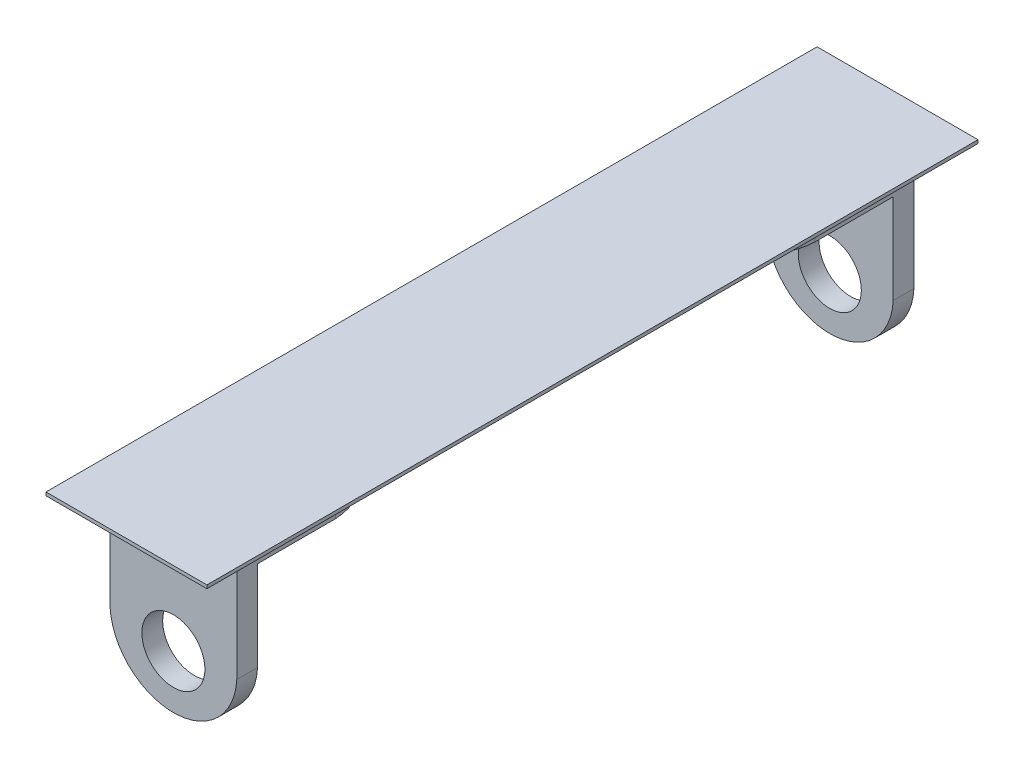
ISO-10303-21;
HEADER;
FILE_DESCRIPTION(('STEP AP214'),'2;1');
FILE_NAME('part.step','',(''),(''),'','','');
FILE_SCHEMA(('AUTOMOTIVE_DESIGN { 1 0 10303 214 1 1 1 1 }'));
ENDSEC;
DATA;
#1=APPLICATION_CONTEXT('core data for automotive mechanical design processes');
#2=APPLICATION_PROTOCOL_DEFINITION('international standard','automotive_design',2000,#1);
#3=PRODUCT_CONTEXT('',#1,'mechanical');
#4=PRODUCT('Part','Part','',(#3));
#5=PRODUCT_RELATED_PRODUCT_CATEGORY('part','',(#4));
#6=PRODUCT_DEFINITION_FORMATION('','',#4);
#7=PRODUCT_DEFINITION_CONTEXT('part definition',#1,'design');
#8=PRODUCT_DEFINITION('design','',#6,#7);
#9=PRODUCT_DEFINITION_SHAPE('','',#8);
#10=(LENGTH_UNIT() NAMED_UNIT(*) SI_UNIT(.MILLI.,.METRE.));
#11=(NAMED_UNIT(*) PLANE_ANGLE_UNIT() SI_UNIT($,.RADIAN.));
#12=(NAMED_UNIT(*) SI_UNIT($,.STERADIAN.) SOLID_ANGLE_UNIT());
#13=UNCERTAINTY_MEASURE_WITH_UNIT(LENGTH_MEASURE(1.E-05),#10,'distance_accuracy_value','');
#14=(GEOMETRIC_REPRESENTATION_CONTEXT(3) GLOBAL_UNCERTAINTY_ASSIGNED_CONTEXT((#13)) GLOBAL_UNIT_ASSIGNED_CONTEXT((#10,
#11,#12)) REPRESENTATION_CONTEXT('',''));
#15=CARTESIAN_POINT('',(0.,0.,0.));
#16=DIRECTION('',(0.,0.,1.));
#17=DIRECTION('',(1.,0.,0.));
#18=AXIS2_PLACEMENT_3D('',#15,#16,#17);
#19=CARTESIAN_POINT('',(0.,1.37217727272736,9.19479999999988));
#20=DIRECTION('',(0.,-1.,0.));
#21=DIRECTION('',(0.,0.,1.));
#22=AXIS2_PLACEMENT_3D('',#19,#20,#21);
#23=SPHERICAL_SURFACE('',#22,2.71837727272727);
#24=CARTESIAN_POINT('',(0.,-0.7874,9.19479999999988));
#25=DIRECTION('',(0.,-1.,0.));
#26=DIRECTION('',(0.,0.,-1.));
#27=AXIS2_PLACEMENT_3D('',#24,#25,#26);
#28=CIRCLE('',#27,1.65099999999988);
#29=CARTESIAN_POINT('',(0.,-0.7874,7.5438));
#30=VERTEX_POINT('',#29);
#31=EDGE_CURVE('E542',#30,#30,#28,.F.);
#32=ORIENTED_EDGE('',*,*,#31,.F.);
#33=EDGE_LOOP('',(#32));
#34=FACE_BOUND('',#33,.T.);
#35=CARTESIAN_POINT('',(0.,-1.34619999999991,9.19479999999988));
#36=VERTEX_POINT('',#35);
#37=VERTEX_LOOP('',#36);
#38=FACE_BOUND('',#37,.T.);
#39=ADVANCED_FACE('F17',(#34,#38),#23,.T.);
#40=CARTESIAN_POINT('',(-3.048,0.127,-14.605));
#41=DIRECTION('',(0.,1.,0.));
#42=DIRECTION('',(0.,0.,1.));
#43=AXIS2_PLACEMENT_3D('',#40,#41,#42);
#44=PLANE('',#43);
#45=DIRECTION('',(-1.,0.,0.));
#46=VECTOR('',#45,1.);
#47=CARTESIAN_POINT('',(0.,0.127,14.605));
#48=LINE('',#47,#46);
#49=CARTESIAN_POINT('',(3.048,0.127,14.605));
#50=VERTEX_POINT('',#49);
#51=CARTESIAN_POINT('',(-3.048,0.127,14.605));
#52=VERTEX_POINT('',#51);
#53=EDGE_CURVE('E150',#50,#52,#48,.T.);
#54=ORIENTED_EDGE('',*,*,#53,.F.);
#55=DIRECTION('',(0.,0.,1.));
#56=VECTOR('',#55,1.);
#57=CARTESIAN_POINT('',(3.048,0.127,0.));
#58=LINE('',#57,#56);
#59=CARTESIAN_POINT('',(3.048,0.127,-14.605));
#60=VERTEX_POINT('',#59);
#61=EDGE_CURVE('E256',#60,#50,#58,.T.);
#62=ORIENTED_EDGE('',*,*,#61,.F.);
#63=DIRECTION('',(1.,0.,0.));
#64=VECTOR('',#63,1.);
#65=CARTESIAN_POINT('',(0.,0.127,-14.605));
#66=LINE('',#65,#64);
#67=CARTESIAN_POINT('',(-3.048,0.127,-14.605));
#68=VERTEX_POINT('',#67);
#69=EDGE_CURVE('E261',#68,#60,#66,.T.);
#70=ORIENTED_EDGE('',*,*,#69,.F.);
#71=DIRECTION('',(0.,0.,-1.));
#72=VECTOR('',#71,1.);
#73=CARTESIAN_POINT('',(-3.048,0.127,0.));
#74=LINE('',#73,#72);
#75=EDGE_CURVE('E154',#52,#68,#74,.T.);
#76=ORIENTED_EDGE('',*,*,#75,.F.);
#77=EDGE_LOOP('',(#54,#62,#70,#76));
#78=FACE_BOUND('',#77,.T.);
#79=ADVANCED_FACE('F302',(#78),#44,.T.);
#80=CARTESIAN_POINT('',(0.,-4.0738425,12.827));
#81=DIRECTION('',(0.,0.,1.));
#82=DIRECTION('',(0.,-1.,0.));
#83=AXIS2_PLACEMENT_3D('',#80,#81,#82);
#84=CYLINDRICAL_SURFACE('',#83,2.4031575);
#85=CARTESIAN_POINT('',(0.,-4.0738425,12.0396));
#86=DIRECTION('',(0.,0.,1.));
#87=DIRECTION('',(0.,-1.,0.));
#88=AXIS2_PLACEMENT_3D('',#85,#86,#87);
#89=CIRCLE('',#88,2.4031575);
#90=CARTESIAN_POINT('',(2.4003,-4.191,12.0396));
#91=VERTEX_POINT('',#90);
#92=CARTESIAN_POINT('',(-2.4003,-4.191,12.0396));
#93=VERTEX_POINT('',#92);
#94=EDGE_CURVE('E21',#91,#93,#89,.F.);
#95=ORIENTED_EDGE('',*,*,#94,.F.);
#96=DIRECTION('',(0.,0.,1.));
#97=VECTOR('',#96,1.);
#98=CARTESIAN_POINT('',(2.4003,-4.191,12.4333));
#99=LINE('',#98,#97);
#100=CARTESIAN_POINT('',(2.4003,-4.191,12.827));
#101=VERTEX_POINT('',#100);
#102=EDGE_CURVE('E549',#91,#101,#99,.T.);
#103=ORIENTED_EDGE('',*,*,#102,.T.);
#104=CARTESIAN_POINT('',(0.,-4.0738425,12.827));
#105=DIRECTION('',(0.,0.,1.));
#106=DIRECTION('',(0.,-1.,0.));
#107=AXIS2_PLACEMENT_3D('',#104,#105,#106);
#108=CIRCLE('',#107,2.4031575);
#109=CARTESIAN_POINT('',(-2.4003,-4.191,12.827));
#110=VERTEX_POINT('',#109);
#111=EDGE_CURVE('E246',#110,#101,#108,.T.);
#112=ORIENTED_EDGE('',*,*,#111,.F.);
#113=DIRECTION('',(0.,0.,1.));
#114=VECTOR('',#113,1.);
#115=CARTESIAN_POINT('',(-2.4003,-4.19099999999999,10.95232125));
#116=LINE('',#115,#114);
#117=EDGE_CURVE('E247',#93,#110,#116,.T.);
#118=ORIENTED_EDGE('',*,*,#117,.F.);
#119=EDGE_LOOP('',(#95,#103,#112,#118));
#120=FACE_BOUND('',#119,.T.);
#121=ADVANCED_FACE('F299',(#120),#84,.T.);
#122=CARTESIAN_POINT('',(0.,-4.4577,12.0396));
#123=DIRECTION('',(0.,0.,1.));
#124=DIRECTION('',(0.,-1.,0.));
#125=AXIS2_PLACEMENT_3D('',#122,#123,#124);
#126=CYLINDRICAL_SURFACE('',#125,1.1938);
#127=CARTESIAN_POINT('',(0.,-4.4577,12.827));
#128=DIRECTION('',(0.,0.,1.));
#129=DIRECTION('',(0.,-1.,0.));
#130=AXIS2_PLACEMENT_3D('',#127,#128,#129);
#131=CIRCLE('',#130,1.1938);
#132=CARTESIAN_POINT('',(0.,-5.6515,12.827));
#133=VERTEX_POINT('',#132);
#134=EDGE_CURVE('E236',#133,#133,#131,.F.);
#135=ORIENTED_EDGE('',*,*,#134,.F.);
#136=EDGE_LOOP('',(#135));
#137=FACE_BOUND('',#136,.T.);
#138=CARTESIAN_POINT('',(0.,-4.4577,12.0396));
#139=DIRECTION('',(0.,0.,1.));
#140=DIRECTION('',(0.,-1.,0.));
#141=AXIS2_PLACEMENT_3D('',#138,#139,#140);
#142=CIRCLE('',#141,1.1938);
#143=CARTESIAN_POINT('',(0.,-5.6515,12.0396));
#144=VERTEX_POINT('',#143);
#145=EDGE_CURVE('E545',#144,#144,#142,.T.);
#146=ORIENTED_EDGE('',*,*,#145,.F.);
#147=EDGE_LOOP('',(#146));
#148=FACE_BOUND('',#147,.T.);
#149=ADVANCED_FACE('F295',(#137,#148),#126,.F.);
#150=CARTESIAN_POINT('',(2.4003,-6.5111376,12.0396));
#151=DIRECTION('',(0.,0.,-1.));
#152=DIRECTION('',(-1.,0.,0.));
#153=AXIS2_PLACEMENT_3D('',#150,#151,#152);
#154=PLANE('',#153);
#155=ORIENTED_EDGE('',*,*,#145,.T.);
#156=EDGE_LOOP('',(#155));
#157=FACE_BOUND('',#156,.T.);
#158=DIRECTION('',(0.,1.,0.));
#159=VECTOR('',#158,1.);
#160=CARTESIAN_POINT('',(2.4003,-4.191,12.0396));
#161=LINE('',#160,#159);
#162=CARTESIAN_POINT('',(2.4003,-0.787400000000006,12.0396));
#163=VERTEX_POINT('',#162);
#164=EDGE_CURVE('E235',#91,#163,#161,.T.);
#165=ORIENTED_EDGE('',*,*,#164,.F.);
#166=ORIENTED_EDGE('',*,*,#94,.T.);
#167=DIRECTION('',(0.,1.,0.));
#168=VECTOR('',#167,1.);
#169=CARTESIAN_POINT('',(-2.4003,-4.19099999999999,12.0396));
#170=LINE('',#169,#168);
#171=CARTESIAN_POINT('',(-2.4003,-0.787400000000004,12.0396));
#172=VERTEX_POINT('',#171);
#173=EDGE_CURVE('E510',#172,#93,#170,.F.);
#174=ORIENTED_EDGE('',*,*,#173,.F.);
#175=DIRECTION('',(1.,0.,0.));
#176=VECTOR('',#175,1.);
#177=CARTESIAN_POINT('',(-2.4003,-0.7874,12.0396));
#178=LINE('',#177,#176);
#179=EDGE_CURVE('E106',#163,#172,#178,.F.);
#180=ORIENTED_EDGE('',*,*,#179,.F.);
#181=EDGE_LOOP('',(#165,#166,#174,#180));
#182=FACE_BOUND('',#181,.T.);
#183=ADVANCED_FACE('F291',(#157,#182),#154,.T.);
#184=CARTESIAN_POINT('',(-2.4003,-0.7874,12.0396));
#185=DIRECTION('',(0.,-1.,0.));
#186=DIRECTION('',(0.,0.,-1.));
#187=AXIS2_PLACEMENT_3D('',#184,#185,#186);
#188=PLANE('',#187);
#189=ORIENTED_EDGE('',*,*,#31,.T.);
#190=EDGE_LOOP('',(#189));
#191=FACE_BOUND('',#190,.T.);
#192=CARTESIAN_POINT('',(0.,-0.7874,9.1948));
#193=DIRECTION('',(0.,1.,0.));
#194=DIRECTION('',(0.,0.,1.));
#195=AXIS2_PLACEMENT_3D('',#192,#193,#194);
#196=CIRCLE('',#195,2.4031575);
#197=CARTESIAN_POINT('',(2.4003,-0.787400000000004,9.07764249999999));
#198=VERTEX_POINT('',#197);
#199=CARTESIAN_POINT('',(-2.4003,-0.787400000000003,9.07764249999999));
#200=VERTEX_POINT('',#199);
#201=EDGE_CURVE('E217',#198,#200,#196,.T.);
#202=ORIENTED_EDGE('',*,*,#201,.F.);
#203=DIRECTION('',(0.,0.,-1.));
#204=VECTOR('',#203,1.);
#205=CARTESIAN_POINT('',(2.4003,-0.787400000000008,10.95232125));
#206=LINE('',#205,#204);
#207=EDGE_CURVE('E221',#163,#198,#206,.T.);
#208=ORIENTED_EDGE('',*,*,#207,.F.);
#209=ORIENTED_EDGE('',*,*,#179,.T.);
#210=DIRECTION('',(0.,0.,1.));
#211=VECTOR('',#210,1.);
#212=CARTESIAN_POINT('',(-2.4003,-0.787400000000006,10.95232125));
#213=LINE('',#212,#211);
#214=EDGE_CURVE('E251',#200,#172,#213,.T.);
#215=ORIENTED_EDGE('',*,*,#214,.F.);
#216=EDGE_LOOP('',(#202,#208,#209,#215));
#217=FACE_BOUND('',#216,.T.);
#218=ADVANCED_FACE('F287',(#191,#217),#188,.T.);
#219=CARTESIAN_POINT('',(0.,-4.0738425,-12.827));
#220=DIRECTION('',(0.,0.,-1.));
#221=DIRECTION('',(0.,1.,0.));
#222=AXIS2_PLACEMENT_3D('',#219,#220,#221);
#223=CYLINDRICAL_SURFACE('',#222,2.4031575);
#224=CARTESIAN_POINT('',(0.,-4.0738425,-12.0396));
#225=DIRECTION('',(0.,0.,-1.));
#226=DIRECTION('',(0.,1.,0.));
#227=AXIS2_PLACEMENT_3D('',#224,#225,#226);
#228=CIRCLE('',#227,2.4031575);
#229=CARTESIAN_POINT('',(-2.4003,-4.19099999999999,-12.0396));
#230=VERTEX_POINT('',#229);
#231=CARTESIAN_POINT('',(2.4003,-4.191,-12.0396));
#232=VERTEX_POINT('',#231);
#233=EDGE_CURVE('E538',#230,#232,#228,.F.);
#234=ORIENTED_EDGE('',*,*,#233,.F.);
#235=DIRECTION('',(0.,0.,-1.));
#236=VECTOR('',#235,1.);
#237=CARTESIAN_POINT('',(-2.4003,-4.19099999999997,-12.4333));
#238=LINE('',#237,#236);
#239=CARTESIAN_POINT('',(-2.4003,-4.19099999999999,-12.827));
#240=VERTEX_POINT('',#239);
#241=EDGE_CURVE('E541',#230,#240,#238,.T.);
#242=ORIENTED_EDGE('',*,*,#241,.T.);
#243=CARTESIAN_POINT('',(0.,-4.0738425,-12.827));
#244=DIRECTION('',(0.,0.,-1.));
#245=DIRECTION('',(0.,1.,0.));
#246=AXIS2_PLACEMENT_3D('',#243,#244,#245);
#247=CIRCLE('',#246,2.4031575);
#248=CARTESIAN_POINT('',(2.4003,-4.191,-12.827));
#249=VERTEX_POINT('',#248);
#250=EDGE_CURVE('E216',#249,#240,#247,.T.);
#251=ORIENTED_EDGE('',*,*,#250,.F.);
#252=DIRECTION('',(0.,0.,1.));
#253=VECTOR('',#252,1.);
#254=CARTESIAN_POINT('',(2.4003,-4.191,-12.4333));
#255=LINE('',#254,#253);
#256=EDGE_CURVE('E544',#249,#232,#255,.T.);
#257=ORIENTED_EDGE('',*,*,#256,.T.);
#258=EDGE_LOOP('',(#234,#242,#251,#257));
#259=FACE_BOUND('',#258,.T.);
#260=ADVANCED_FACE('F283',(#259),#223,.T.);
#261=CARTESIAN_POINT('',(0.,-4.4577,-12.0396));
#262=DIRECTION('',(0.,0.,-1.));
#263=DIRECTION('',(0.,1.,0.));
#264=AXIS2_PLACEMENT_3D('',#261,#262,#263);
#265=CYLINDRICAL_SURFACE('',#264,1.1938);
#266=CARTESIAN_POINT('',(0.,-4.4577,-12.827));
#267=DIRECTION('',(0.,0.,-1.));
#268=DIRECTION('',(0.,1.,0.));
#269=AXIS2_PLACEMENT_3D('',#266,#267,#268);
#270=CIRCLE('',#269,1.1938);
#271=CARTESIAN_POINT('',(0.,-3.2639,-12.827));
#272=VERTEX_POINT('',#271);
#273=EDGE_CURVE('E201',#272,#272,#270,.F.);
#274=ORIENTED_EDGE('',*,*,#273,.F.);
#275=EDGE_LOOP('',(#274));
#276=FACE_BOUND('',#275,.T.);
#277=CARTESIAN_POINT('',(0.,-4.4577,-12.0396));
#278=DIRECTION('',(0.,0.,-1.));
#279=DIRECTION('',(0.,1.,0.));
#280=AXIS2_PLACEMENT_3D('',#277,#278,#279);
#281=CIRCLE('',#280,1.1938);
#282=CARTESIAN_POINT('',(0.,-3.2639,-12.0396));
#283=VERTEX_POINT('',#282);
#284=EDGE_CURVE('E263',#283,#283,#281,.T.);
#285=ORIENTED_EDGE('',*,*,#284,.F.);
#286=EDGE_LOOP('',(#285));
#287=FACE_BOUND('',#286,.T.);
#288=ADVANCED_FACE('F279',(#276,#287),#265,.F.);
#289=CARTESIAN_POINT('',(-2.4003,-6.5111376,-12.0396));
#290=DIRECTION('',(0.,0.,1.));
#291=DIRECTION('',(1.,0.,0.));
#292=AXIS2_PLACEMENT_3D('',#289,#290,#291);
#293=PLANE('',#292);
#294=ORIENTED_EDGE('',*,*,#284,.T.);
#295=EDGE_LOOP('',(#294));
#296=FACE_BOUND('',#295,.T.);
#297=ORIENTED_EDGE('',*,*,#233,.T.);
#298=DIRECTION('',(0.,1.,0.));
#299=VECTOR('',#298,1.);
#300=CARTESIAN_POINT('',(2.4003,-4.191,-12.0396));
#301=LINE('',#300,#299);
#302=CARTESIAN_POINT('',(2.4003,-0.7874,-12.0396));
#303=VERTEX_POINT('',#302);
#304=EDGE_CURVE('E185',#303,#232,#301,.F.);
#305=ORIENTED_EDGE('',*,*,#304,.F.);
#306=DIRECTION('',(1.,0.,0.));
#307=VECTOR('',#306,1.);
#308=CARTESIAN_POINT('',(-2.4003,-0.7874,-12.0396));
#309=LINE('',#308,#307);
#310=CARTESIAN_POINT('',(-2.4003,-0.787400000000002,-12.0396));
#311=VERTEX_POINT('',#310);
#312=EDGE_CURVE('E184',#311,#303,#309,.T.);
#313=ORIENTED_EDGE('',*,*,#312,.F.);
#314=DIRECTION('',(0.,1.,0.));
#315=VECTOR('',#314,1.);
#316=CARTESIAN_POINT('',(-2.4003,-4.19099999999999,-12.0396));
#317=LINE('',#316,#315);
#318=EDGE_CURVE('E197',#230,#311,#317,.T.);
#319=ORIENTED_EDGE('',*,*,#318,.F.);
#320=EDGE_LOOP('',(#297,#305,#313,#319));
#321=FACE_BOUND('',#320,.T.);
#322=ADVANCED_FACE('F274',(#296,#321),#293,.T.);
#323=CARTESIAN_POINT('',(0.,1.37217727272735,-9.19480000000012));
#324=DIRECTION('',(0.,-1.,0.));
#325=DIRECTION('',(0.,0.,1.));
#326=AXIS2_PLACEMENT_3D('',#323,#324,#325);
#327=SPHERICAL_SURFACE('',#326,2.71837727272726);
#328=CARTESIAN_POINT('',(0.,-0.7874,-9.19480000000012));
#329=DIRECTION('',(0.,-1.,0.));
#330=DIRECTION('',(0.,0.,-1.));
#331=AXIS2_PLACEMENT_3D('',#328,#329,#330);
#332=CIRCLE('',#331,1.65099999999988);
#333=CARTESIAN_POINT('',(0.,-0.7874,-10.8458));
#334=VERTEX_POINT('',#333);
#335=EDGE_CURVE('E174',#334,#334,#332,.F.);
#336=ORIENTED_EDGE('',*,*,#335,.F.);
#337=EDGE_LOOP('',(#336));
#338=FACE_BOUND('',#337,.T.);
#339=CARTESIAN_POINT('',(0.,-1.34619999999991,-9.19480000000012));
#340=VERTEX_POINT('',#339);
#341=VERTEX_LOOP('',#340);
#342=FACE_BOUND('',#341,.T.);
#343=ADVANCED_FACE('F269',(#338,#342),#327,.T.);
#344=CARTESIAN_POINT('',(3.048,0.,-14.605));
#345=DIRECTION('',(0.,0.,-1.));
#346=DIRECTION('',(-1.,0.,0.));
#347=AXIS2_PLACEMENT_3D('',#344,#345,#346);
#348=PLANE('',#347);
#349=ORIENTED_EDGE('',*,*,#69,.T.);
#350=DIRECTION('',(0.,1.,0.));
#351=VECTOR('',#350,1.);
#352=CARTESIAN_POINT('',(3.048,0.,-14.605));
#353=LINE('',#352,#351);
#354=CARTESIAN_POINT('',(3.048,0.,-14.605));
#355=VERTEX_POINT('',#354);
#356=EDGE_CURVE('E258',#355,#60,#353,.T.);
#357=ORIENTED_EDGE('',*,*,#356,.F.);
#358=DIRECTION('',(1.,0.,0.));
#359=VECTOR('',#358,1.);
#360=CARTESIAN_POINT('',(-3.048,0.,-14.605));
#361=LINE('',#360,#359);
#362=CARTESIAN_POINT('',(-3.048,0.,-14.605));
#363=VERTEX_POINT('',#362);
#364=EDGE_CURVE('E170',#363,#355,#361,.T.);
#365=ORIENTED_EDGE('',*,*,#364,.F.);
#366=DIRECTION('',(0.,1.,0.));
#367=VECTOR('',#366,1.);
#368=CARTESIAN_POINT('',(-3.048,0.,-14.605));
#369=LINE('',#368,#367);
#370=EDGE_CURVE('E161',#68,#363,#369,.F.);
#371=ORIENTED_EDGE('',*,*,#370,.F.);
#372=EDGE_LOOP('',(#349,#357,#365,#371));
#373=FACE_BOUND('',#372,.T.);
#374=ADVANCED_FACE('F273',(#373),#348,.T.);
#375=CARTESIAN_POINT('',(3.048,0.,14.605));
#376=DIRECTION('',(1.,0.,0.));
#377=DIRECTION('',(0.,0.,-1.));
#378=AXIS2_PLACEMENT_3D('',#375,#376,#377);
#379=PLANE('',#378);
#380=ORIENTED_EDGE('',*,*,#61,.T.);
#381=DIRECTION('',(0.,1.,0.));
#382=VECTOR('',#381,1.);
#383=CARTESIAN_POINT('',(3.048,0.,14.605));
#384=LINE('',#383,#382);
#385=CARTESIAN_POINT('',(3.048,0.,14.605));
#386=VERTEX_POINT('',#385);
#387=EDGE_CURVE('E254',#386,#50,#384,.T.);
#388=ORIENTED_EDGE('',*,*,#387,.F.);
#389=DIRECTION('',(0.,0.,1.));
#390=VECTOR('',#389,1.);
#391=CARTESIAN_POINT('',(3.048,0.,0.));
#392=LINE('',#391,#390);
#393=EDGE_CURVE('E168',#355,#386,#392,.T.);
#394=ORIENTED_EDGE('',*,*,#393,.F.);
#395=ORIENTED_EDGE('',*,*,#356,.T.);
#396=EDGE_LOOP('',(#380,#388,#394,#395));
#397=FACE_BOUND('',#396,.T.);
#398=ADVANCED_FACE('F355',(#397),#379,.T.);
#399=CARTESIAN_POINT('',(-3.048,0.,14.605));
#400=DIRECTION('',(0.,0.,1.));
#401=DIRECTION('',(1.,0.,0.));
#402=AXIS2_PLACEMENT_3D('',#399,#400,#401);
#403=PLANE('',#402);
#404=ORIENTED_EDGE('',*,*,#53,.T.);
#405=DIRECTION('',(0.,1.,0.));
#406=VECTOR('',#405,1.);
#407=CARTESIAN_POINT('',(-3.048,0.,14.605));
#408=LINE('',#407,#406);
#409=CARTESIAN_POINT('',(-3.048,0.,14.605));
#410=VERTEX_POINT('',#409);
#411=EDGE_CURVE('E142',#410,#52,#408,.T.);
#412=ORIENTED_EDGE('',*,*,#411,.F.);
#413=DIRECTION('',(1.,0.,0.));
#414=VECTOR('',#413,1.);
#415=CARTESIAN_POINT('',(-3.048,0.,14.605));
#416=LINE('',#415,#414);
#417=EDGE_CURVE('E147',#386,#410,#416,.F.);
#418=ORIENTED_EDGE('',*,*,#417,.F.);
#419=ORIENTED_EDGE('',*,*,#387,.T.);
#420=EDGE_LOOP('',(#404,#412,#418,#419));
#421=FACE_BOUND('',#420,.T.);
#422=ADVANCED_FACE('F144',(#421),#403,.T.);
#423=CARTESIAN_POINT('',(-3.048,0.,-14.605));
#424=DIRECTION('',(-1.,0.,0.));
#425=DIRECTION('',(0.,0.,1.));
#426=AXIS2_PLACEMENT_3D('',#423,#424,#425);
#427=PLANE('',#426);
#428=ORIENTED_EDGE('',*,*,#75,.T.);
#429=ORIENTED_EDGE('',*,*,#370,.T.);
#430=DIRECTION('',(0.,0.,-1.));
#431=VECTOR('',#430,1.);
#432=CARTESIAN_POINT('',(-3.048,0.,0.));
#433=LINE('',#432,#431);
#434=EDGE_CURVE('E158',#410,#363,#433,.T.);
#435=ORIENTED_EDGE('',*,*,#434,.F.);
#436=ORIENTED_EDGE('',*,*,#411,.T.);
#437=EDGE_LOOP('',(#428,#429,#435,#436));
#438=FACE_BOUND('',#437,.T.);
#439=ADVANCED_FACE('F159',(#438),#427,.T.);
#440=CARTESIAN_POINT('',(-2.4003,-4.19099999999999,9.07764250000001));
#441=DIRECTION('',(-1.,0.,0.));
#442=DIRECTION('',(0.,0.,1.));
#443=AXIS2_PLACEMENT_3D('',#440,#441,#442);
#444=PLANE('',#443);
#445=ORIENTED_EDGE('',*,*,#173,.T.);
#446=ORIENTED_EDGE('',*,*,#117,.T.);
#447=DIRECTION('',(0.,1.,0.));
#448=VECTOR('',#447,1.);
#449=CARTESIAN_POINT('',(-2.4003,-6.515862,12.827));
#450=LINE('',#449,#448);
#451=CARTESIAN_POINT('',(-2.4003,0.,12.827));
#452=VERTEX_POINT('',#451);
#453=EDGE_CURVE('E243',#452,#110,#450,.F.);
#454=ORIENTED_EDGE('',*,*,#453,.F.);
#455=DIRECTION('',(0.,0.,1.));
#456=VECTOR('',#455,1.);
#457=CARTESIAN_POINT('',(-2.4003,0.,0.));
#458=LINE('',#457,#456);
#459=CARTESIAN_POINT('',(-2.4003,0.,9.07764249999999));
#460=VERTEX_POINT('',#459);
#461=EDGE_CURVE('E164',#460,#452,#458,.T.);
#462=ORIENTED_EDGE('',*,*,#461,.F.);
#463=DIRECTION('',(0.,1.,0.));
#464=VECTOR('',#463,1.);
#465=CARTESIAN_POINT('',(-2.4003,-0.3937,9.07764250000002));
#466=LINE('',#465,#464);
#467=EDGE_CURVE('E213',#200,#460,#466,.T.);
#468=ORIENTED_EDGE('',*,*,#467,.F.);
#469=ORIENTED_EDGE('',*,*,#214,.T.);
#470=EDGE_LOOP('',(#445,#446,#454,#462,#468,#469));
#471=FACE_BOUND('',#470,.T.);
#472=ADVANCED_FACE('F347',(#471),#444,.T.);
#473=CARTESIAN_POINT('',(-2.4003,-6.515862,12.827));
#474=DIRECTION('',(0.,0.,1.));
#475=DIRECTION('',(1.,0.,0.));
#476=AXIS2_PLACEMENT_3D('',#473,#474,#475);
#477=PLANE('',#476);
#478=ORIENTED_EDGE('',*,*,#134,.T.);
#479=EDGE_LOOP('',(#478));
#480=FACE_BOUND('',#479,.T.);
#481=DIRECTION('',(0.,1.,0.));
#482=VECTOR('',#481,1.);
#483=CARTESIAN_POINT('',(2.4003,-4.191,12.827));
#484=LINE('',#483,#482);
#485=CARTESIAN_POINT('',(2.4003,0.,12.827));
#486=VERTEX_POINT('',#485);
#487=EDGE_CURVE('E232',#486,#101,#484,.F.);
#488=ORIENTED_EDGE('',*,*,#487,.F.);
#489=DIRECTION('',(1.,0.,0.));
#490=VECTOR('',#489,1.);
#491=CARTESIAN_POINT('',(-3.048,0.,12.827));
#492=LINE('',#491,#490);
#493=EDGE_CURVE('E225',#452,#486,#492,.T.);
#494=ORIENTED_EDGE('',*,*,#493,.F.);
#495=ORIENTED_EDGE('',*,*,#453,.T.);
#496=ORIENTED_EDGE('',*,*,#111,.T.);
#497=EDGE_LOOP('',(#488,#494,#495,#496));
#498=FACE_BOUND('',#497,.T.);
#499=ADVANCED_FACE('F343',(#480,#498),#477,.T.);
#500=CARTESIAN_POINT('',(2.4003,-4.191,12.827));
#501=DIRECTION('',(1.,0.,0.));
#502=DIRECTION('',(0.,0.,-1.));
#503=AXIS2_PLACEMENT_3D('',#500,#501,#502);
#504=PLANE('',#503);
#505=ORIENTED_EDGE('',*,*,#207,.T.);
#506=DIRECTION('',(0.,-1.,0.));
#507=VECTOR('',#506,1.);
#508=CARTESIAN_POINT('',(2.4003,-0.3937,9.07764250000001));
#509=LINE('',#508,#507);
#510=CARTESIAN_POINT('',(2.4003,0.,9.0776425));
#511=VERTEX_POINT('',#510);
#512=EDGE_CURVE('E218',#511,#198,#509,.T.);
#513=ORIENTED_EDGE('',*,*,#512,.F.);
#514=DIRECTION('',(0.,0.,-1.));
#515=VECTOR('',#514,1.);
#516=CARTESIAN_POINT('',(2.4003,0.,0.));
#517=LINE('',#516,#515);
#518=EDGE_CURVE('E222',#486,#511,#517,.T.);
#519=ORIENTED_EDGE('',*,*,#518,.F.);
#520=ORIENTED_EDGE('',*,*,#487,.T.);
#521=ORIENTED_EDGE('',*,*,#102,.F.);
#522=ORIENTED_EDGE('',*,*,#164,.T.);
#523=EDGE_LOOP('',(#505,#513,#519,#520,#521,#522));
#524=FACE_BOUND('',#523,.T.);
#525=ADVANCED_FACE('F339',(#524),#504,.T.);
#526=CARTESIAN_POINT('',(0.,0.,9.1948));
#527=DIRECTION('',(0.,1.,0.));
#528=DIRECTION('',(0.,0.,1.));
#529=AXIS2_PLACEMENT_3D('',#526,#527,#528);
#530=CYLINDRICAL_SURFACE('',#529,2.4031575);
#531=ORIENTED_EDGE('',*,*,#201,.T.);
#532=ORIENTED_EDGE('',*,*,#467,.T.);
#533=CARTESIAN_POINT('',(0.,0.,9.1948));
#534=DIRECTION('',(0.,1.,0.));
#535=DIRECTION('',(0.,0.,1.));
#536=AXIS2_PLACEMENT_3D('',#533,#534,#535);
#537=CIRCLE('',#536,2.4031575);
#538=EDGE_CURVE('E206',#511,#460,#537,.T.);
#539=ORIENTED_EDGE('',*,*,#538,.F.);
#540=ORIENTED_EDGE('',*,*,#512,.T.);
#541=EDGE_LOOP('',(#531,#532,#539,#540));
#542=FACE_BOUND('',#541,.T.);
#543=ADVANCED_FACE('F335',(#542),#530,.T.);
#544=CARTESIAN_POINT('',(2.4003,-6.515862,-12.827));
#545=DIRECTION('',(0.,0.,-1.));
#546=DIRECTION('',(-1.,0.,0.));
#547=AXIS2_PLACEMENT_3D('',#544,#545,#546);
#548=PLANE('',#547);
#549=ORIENTED_EDGE('',*,*,#273,.T.);
#550=EDGE_LOOP('',(#549));
#551=FACE_BOUND('',#550,.T.);
#552=DIRECTION('',(0.,1.,0.));
#553=VECTOR('',#552,1.);
#554=CARTESIAN_POINT('',(2.4003,-4.191,-12.827));
#555=LINE('',#554,#553);
#556=CARTESIAN_POINT('',(2.4003,0.,-12.827));
#557=VERTEX_POINT('',#556);
#558=EDGE_CURVE('E195',#249,#557,#555,.T.);
#559=ORIENTED_EDGE('',*,*,#558,.F.);
#560=ORIENTED_EDGE('',*,*,#250,.T.);
#561=DIRECTION('',(0.,1.,0.));
#562=VECTOR('',#561,1.);
#563=CARTESIAN_POINT('',(-2.4003,-4.19099999999999,-12.827));
#564=LINE('',#563,#562);
#565=CARTESIAN_POINT('',(-2.4003,0.,-12.827));
#566=VERTEX_POINT('',#565);
#567=EDGE_CURVE('E198',#566,#240,#564,.F.);
#568=ORIENTED_EDGE('',*,*,#567,.F.);
#569=DIRECTION('',(1.,0.,0.));
#570=VECTOR('',#569,1.);
#571=CARTESIAN_POINT('',(-3.048,0.,-12.827));
#572=LINE('',#571,#570);
#573=EDGE_CURVE('E178',#557,#566,#572,.F.);
#574=ORIENTED_EDGE('',*,*,#573,.F.);
#575=EDGE_LOOP('',(#559,#560,#568,#574));
#576=FACE_BOUND('',#575,.T.);
#577=ADVANCED_FACE('F332',(#551,#576),#548,.T.);
#578=CARTESIAN_POINT('',(-2.4003,-4.19099999999999,-12.827));
#579=DIRECTION('',(-1.,0.,0.));
#580=DIRECTION('',(0.,0.,1.));
#581=AXIS2_PLACEMENT_3D('',#578,#579,#580);
#582=PLANE('',#581);
#583=DIRECTION('',(0.,0.,-1.));
#584=VECTOR('',#583,1.);
#585=CARTESIAN_POINT('',(-2.4003,-0.7874,-9.3998773775));
#586=LINE('',#585,#584);
#587=CARTESIAN_POINT('',(-2.4003,-0.7874,-9.07764250000002));
#588=VERTEX_POINT('',#587);
#589=EDGE_CURVE('E181',#588,#311,#586,.T.);
#590=ORIENTED_EDGE('',*,*,#589,.F.);
#591=DIRECTION('',(0.,1.,0.));
#592=VECTOR('',#591,1.);
#593=CARTESIAN_POINT('',(-2.4003,-4.19099999999999,-9.07764250000001));
#594=LINE('',#593,#592);
#595=CARTESIAN_POINT('',(-2.4003,0.,-9.07764250000002));
#596=VERTEX_POINT('',#595);
#597=EDGE_CURVE('E36',#588,#596,#594,.T.);
#598=ORIENTED_EDGE('',*,*,#597,.T.);
#599=DIRECTION('',(0.,0.,1.));
#600=VECTOR('',#599,1.);
#601=CARTESIAN_POINT('',(-2.4003,0.,0.));
#602=LINE('',#601,#600);
#603=EDGE_CURVE('E175',#566,#596,#602,.T.);
#604=ORIENTED_EDGE('',*,*,#603,.F.);
#605=ORIENTED_EDGE('',*,*,#567,.T.);
#606=ORIENTED_EDGE('',*,*,#241,.F.);
#607=ORIENTED_EDGE('',*,*,#318,.T.);
#608=EDGE_LOOP('',(#590,#598,#604,#605,#606,#607));
#609=FACE_BOUND('',#608,.T.);
#610=ADVANCED_FACE('F328',(#609),#582,.T.);
#611=CARTESIAN_POINT('',(2.4003,-4.191,-9.0776425));
#612=DIRECTION('',(1.,0.,0.));
#613=DIRECTION('',(0.,0.,-1.));
#614=AXIS2_PLACEMENT_3D('',#611,#612,#613);
#615=PLANE('',#614);
#616=ORIENTED_EDGE('',*,*,#304,.T.);
#617=ORIENTED_EDGE('',*,*,#256,.F.);
#618=ORIENTED_EDGE('',*,*,#558,.T.);
#619=DIRECTION('',(0.,0.,-1.));
#620=VECTOR('',#619,1.);
#621=CARTESIAN_POINT('',(2.4003,0.,0.));
#622=LINE('',#621,#620);
#623=CARTESIAN_POINT('',(2.4003,0.,-9.07764250000002));
#624=VERTEX_POINT('',#623);
#625=EDGE_CURVE('E177',#624,#557,#622,.T.);
#626=ORIENTED_EDGE('',*,*,#625,.F.);
#627=DIRECTION('',(0.,1.,0.));
#628=VECTOR('',#627,1.);
#629=CARTESIAN_POINT('',(2.4003,-4.191,-9.0776425));
#630=LINE('',#629,#628);
#631=CARTESIAN_POINT('',(2.4003,-0.7874,-9.07764250000002));
#632=VERTEX_POINT('',#631);
#633=EDGE_CURVE('E192',#624,#632,#630,.F.);
#634=ORIENTED_EDGE('',*,*,#633,.T.);
#635=DIRECTION('',(0.,0.,1.));
#636=VECTOR('',#635,1.);
#637=CARTESIAN_POINT('',(2.4003,-0.7874,-9.3998773775));
#638=LINE('',#637,#636);
#639=EDGE_CURVE('E266',#303,#632,#638,.T.);
#640=ORIENTED_EDGE('',*,*,#639,.F.);
#641=EDGE_LOOP('',(#616,#617,#618,#626,#634,#640));
#642=FACE_BOUND('',#641,.T.);
#643=ADVANCED_FACE('F324',(#642),#615,.T.);
#644=CARTESIAN_POINT('',(-2.4003,-0.7874,-6.760154755));
#645=DIRECTION('',(0.,-1.,0.));
#646=DIRECTION('',(0.,0.,-1.));
#647=AXIS2_PLACEMENT_3D('',#644,#645,#646);
#648=PLANE('',#647);
#649=ORIENTED_EDGE('',*,*,#335,.T.);
#650=EDGE_LOOP('',(#649));
#651=FACE_BOUND('',#650,.T.);
#652=ORIENTED_EDGE('',*,*,#639,.T.);
#653=CARTESIAN_POINT('',(0.,-0.7874,-9.1948));
#654=DIRECTION('',(0.,1.,0.));
#655=DIRECTION('',(0.,0.,1.));
#656=AXIS2_PLACEMENT_3D('',#653,#654,#655);
#657=CIRCLE('',#656,2.4031575);
#658=EDGE_CURVE('E27',#588,#632,#657,.T.);
#659=ORIENTED_EDGE('',*,*,#658,.F.);
#660=ORIENTED_EDGE('',*,*,#589,.T.);
#661=ORIENTED_EDGE('',*,*,#312,.T.);
#662=EDGE_LOOP('',(#652,#659,#660,#661));
#663=FACE_BOUND('',#662,.T.);
#664=ADVANCED_FACE('F318',(#651,#663),#648,.T.);
#665=CARTESIAN_POINT('',(-3.048,0.,14.605));
#666=DIRECTION('',(0.,-1.,0.));
#667=DIRECTION('',(0.,0.,-1.));
#668=AXIS2_PLACEMENT_3D('',#665,#666,#667);
#669=PLANE('',#668);
#670=CARTESIAN_POINT('',(0.,0.,-9.1948));
#671=DIRECTION('',(0.,1.,0.));
#672=DIRECTION('',(0.,0.,1.));
#673=AXIS2_PLACEMENT_3D('',#670,#671,#672);
#674=CIRCLE('',#673,2.4031575);
#675=EDGE_CURVE('E11',#624,#596,#674,.F.);
#676=ORIENTED_EDGE('',*,*,#675,.F.);
#677=ORIENTED_EDGE('',*,*,#625,.T.);
#678=ORIENTED_EDGE('',*,*,#573,.T.);
#679=ORIENTED_EDGE('',*,*,#603,.T.);
#680=EDGE_LOOP('',(#676,#677,#678,#679));
#681=FACE_BOUND('',#680,.T.);
#682=ORIENTED_EDGE('',*,*,#518,.T.);
#683=ORIENTED_EDGE('',*,*,#538,.T.);
#684=ORIENTED_EDGE('',*,*,#461,.T.);
#685=ORIENTED_EDGE('',*,*,#493,.T.);
#686=EDGE_LOOP('',(#682,#683,#684,#685));
#687=FACE_BOUND('',#686,.T.);
#688=ORIENTED_EDGE('',*,*,#417,.T.);
#689=ORIENTED_EDGE('',*,*,#434,.T.);
#690=ORIENTED_EDGE('',*,*,#364,.T.);
#691=ORIENTED_EDGE('',*,*,#393,.T.);
#692=EDGE_LOOP('',(#688,#689,#690,#691));
#693=FACE_BOUND('',#692,.T.);
#694=ADVANCED_FACE('F166',(#681,#687,#693),#669,.T.);
#695=CARTESIAN_POINT('',(0.,0.,-9.1948));
#696=DIRECTION('',(0.,1.,0.));
#697=DIRECTION('',(0.,0.,1.));
#698=AXIS2_PLACEMENT_3D('',#695,#696,#697);
#699=CYLINDRICAL_SURFACE('',#698,2.4031575);
#700=ORIENTED_EDGE('',*,*,#675,.T.);
#701=ORIENTED_EDGE('',*,*,#597,.F.);
#702=ORIENTED_EDGE('',*,*,#658,.T.);
#703=ORIENTED_EDGE('',*,*,#633,.F.);
#704=EDGE_LOOP('',(#700,#701,#702,#703));
#705=FACE_BOUND('',#704,.T.);
#706=ADVANCED_FACE('F311',(#705),#699,.T.);
#707=CLOSED_SHELL('',(#39,#79,#121,#149,#183,#218,#260,#288,#322,#343,#374,#398,#422,#439,#472,
#499,#525,#543,#577,#610,#643,#664,#694,#706));
#708=MANIFOLD_SOLID_BREP('B1',#707);
#709=ADVANCED_BREP_SHAPE_REPRESENTATION('',(#18,#708),#14);
#710=SHAPE_DEFINITION_REPRESENTATION(#9,#709);
ENDSEC;
END-ISO-10303-21;
